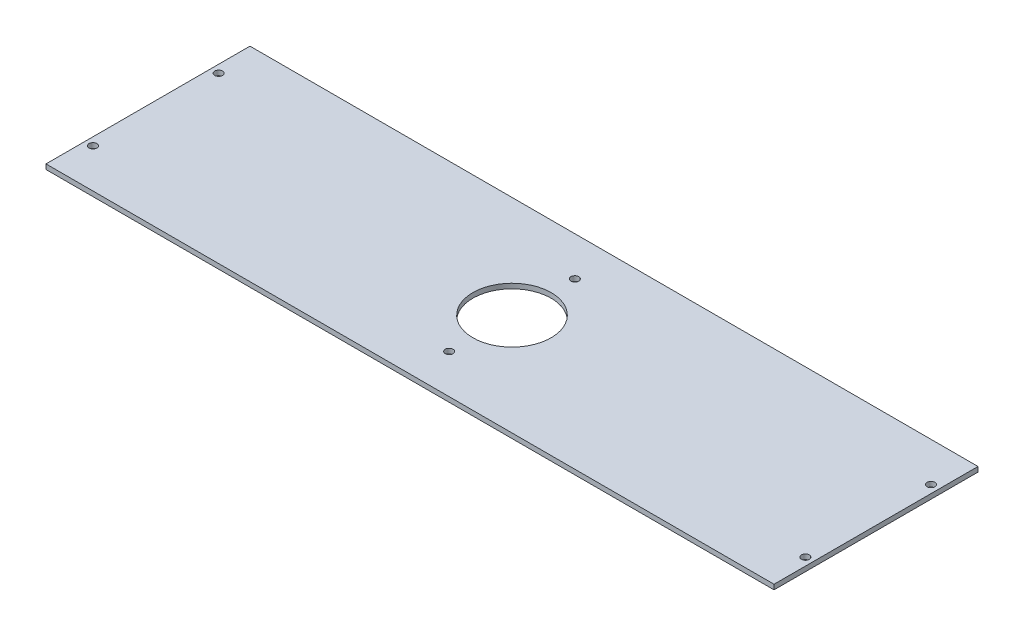
ISO-10303-21;
HEADER;
FILE_DESCRIPTION(('STEP AP214'),'2;1');
FILE_NAME('part.step','',(''),(''),'','','');
FILE_SCHEMA(('AUTOMOTIVE_DESIGN { 1 0 10303 214 1 1 1 1 }'));
ENDSEC;
DATA;
#1=APPLICATION_CONTEXT('core data for automotive mechanical design processes');
#2=APPLICATION_PROTOCOL_DEFINITION('international standard','automotive_design',2000,#1);
#3=PRODUCT_CONTEXT('',#1,'mechanical');
#4=PRODUCT('Part','Part','',(#3));
#5=PRODUCT_RELATED_PRODUCT_CATEGORY('part','',(#4));
#6=PRODUCT_DEFINITION_FORMATION('','',#4);
#7=PRODUCT_DEFINITION_CONTEXT('part definition',#1,'design');
#8=PRODUCT_DEFINITION('design','',#6,#7);
#9=PRODUCT_DEFINITION_SHAPE('','',#8);
#10=(LENGTH_UNIT() NAMED_UNIT(*) SI_UNIT(.MILLI.,.METRE.));
#11=(NAMED_UNIT(*) PLANE_ANGLE_UNIT() SI_UNIT($,.RADIAN.));
#12=(NAMED_UNIT(*) SI_UNIT($,.STERADIAN.) SOLID_ANGLE_UNIT());
#13=UNCERTAINTY_MEASURE_WITH_UNIT(LENGTH_MEASURE(1.E-05),#10,'distance_accuracy_value','');
#14=(GEOMETRIC_REPRESENTATION_CONTEXT(3) GLOBAL_UNCERTAINTY_ASSIGNED_CONTEXT((#13)) GLOBAL_UNIT_ASSIGNED_CONTEXT((#10,
#11,#12)) REPRESENTATION_CONTEXT('',''));
#15=CARTESIAN_POINT('',(0.,0.,0.));
#16=DIRECTION('',(0.,0.,1.));
#17=DIRECTION('',(1.,0.,0.));
#18=AXIS2_PLACEMENT_3D('',#15,#16,#17);
#19=CARTESIAN_POINT('',(-113.83018179896,2.5,-59.2961910720666));
#20=DIRECTION('',(1.,0.,0.));
#21=DIRECTION('',(0.,0.,-1.));
#22=AXIS2_PLACEMENT_3D('',#19,#20,#21);
#23=PLANE('',#22);
#24=DIRECTION('',(0.,0.,1.));
#25=VECTOR('',#24,1.);
#26=CARTESIAN_POINT('',(-113.83018179896,0.,-59.2961910720666));
#27=LINE('',#26,#25);
#28=CARTESIAN_POINT('',(-113.83018179896,0.,-59.2961910720666));
#29=VERTEX_POINT('',#28);
#30=CARTESIAN_POINT('',(-113.83018179896,0.,44.9238089279334));
#31=VERTEX_POINT('',#30);
#32=EDGE_CURVE('E109',#29,#31,#27,.T.);
#33=ORIENTED_EDGE('',*,*,#32,.T.);
#34=DIRECTION('',(0.,-1.,0.));
#35=VECTOR('',#34,1.);
#36=CARTESIAN_POINT('',(-113.83018179896,2.5,44.9238089279334));
#37=LINE('',#36,#35);
#38=CARTESIAN_POINT('',(-113.83018179896,2.5,44.9238089279334));
#39=VERTEX_POINT('',#38);
#40=EDGE_CURVE('E11',#39,#31,#37,.T.);
#41=ORIENTED_EDGE('',*,*,#40,.F.);
#42=DIRECTION('',(0.,0.,1.));
#43=VECTOR('',#42,1.);
#44=CARTESIAN_POINT('',(-113.83018179896,2.5,-59.2961910720666));
#45=LINE('',#44,#43);
#46=CARTESIAN_POINT('',(-113.83018179896,2.5,-59.2961910720666));
#47=VERTEX_POINT('',#46);
#48=EDGE_CURVE('E90',#47,#39,#45,.T.);
#49=ORIENTED_EDGE('',*,*,#48,.F.);
#50=DIRECTION('',(0.,-1.,0.));
#51=VECTOR('',#50,1.);
#52=CARTESIAN_POINT('',(-113.83018179896,2.5,-59.2961910720666));
#53=LINE('',#52,#51);
#54=EDGE_CURVE('E57',#47,#29,#53,.T.);
#55=ORIENTED_EDGE('',*,*,#54,.T.);
#56=EDGE_LOOP('',(#33,#41,#49,#55));
#57=FACE_BOUND('',#56,.T.);
#58=ADVANCED_FACE('F38',(#57),#23,.F.);
#59=CARTESIAN_POINT('',(-113.83018179896,2.5,44.9238089279334));
#60=DIRECTION('',(0.,0.,-1.));
#61=DIRECTION('',(-1.,0.,0.));
#62=AXIS2_PLACEMENT_3D('',#59,#60,#61);
#63=PLANE('',#62);
#64=DIRECTION('',(1.,0.,0.));
#65=VECTOR('',#64,1.);
#66=CARTESIAN_POINT('',(-113.83018179896,0.,44.9238089279334));
#67=LINE('',#66,#65);
#68=CARTESIAN_POINT('',(258.16981820104,0.,44.9238089279334));
#69=VERTEX_POINT('',#68);
#70=EDGE_CURVE('E96',#31,#69,#67,.T.);
#71=ORIENTED_EDGE('',*,*,#70,.T.);
#72=DIRECTION('',(0.,-1.,0.));
#73=VECTOR('',#72,1.);
#74=CARTESIAN_POINT('',(258.16981820104,2.5,44.9238089279334));
#75=LINE('',#74,#73);
#76=CARTESIAN_POINT('',(258.16981820104,2.5,44.9238089279334));
#77=VERTEX_POINT('',#76);
#78=EDGE_CURVE('E48',#77,#69,#75,.T.);
#79=ORIENTED_EDGE('',*,*,#78,.F.);
#80=DIRECTION('',(1.,0.,0.));
#81=VECTOR('',#80,1.);
#82=CARTESIAN_POINT('',(-113.83018179896,2.5,44.9238089279334));
#83=LINE('',#82,#81);
#84=EDGE_CURVE('E82',#39,#77,#83,.T.);
#85=ORIENTED_EDGE('',*,*,#84,.F.);
#86=ORIENTED_EDGE('',*,*,#40,.T.);
#87=EDGE_LOOP('',(#71,#79,#85,#86));
#88=FACE_BOUND('',#87,.T.);
#89=ADVANCED_FACE('F95',(#88),#63,.F.);
#90=CARTESIAN_POINT('',(258.16981820104,2.5,-59.2961910720666));
#91=DIRECTION('',(1.,0.,0.));
#92=DIRECTION('',(0.,0.,-1.));
#93=AXIS2_PLACEMENT_3D('',#90,#91,#92);
#94=PLANE('',#93);
#95=DIRECTION('',(0.,0.,1.));
#96=VECTOR('',#95,1.);
#97=CARTESIAN_POINT('',(258.16981820104,0.,-59.2961910720666));
#98=LINE('',#97,#96);
#99=CARTESIAN_POINT('',(258.16981820104,0.,-59.2961910720666));
#100=VERTEX_POINT('',#99);
#101=EDGE_CURVE('E115',#100,#69,#98,.T.);
#102=ORIENTED_EDGE('',*,*,#101,.F.);
#103=DIRECTION('',(0.,-1.,0.));
#104=VECTOR('',#103,1.);
#105=CARTESIAN_POINT('',(258.16981820104,2.5,-59.2961910720666));
#106=LINE('',#105,#104);
#107=CARTESIAN_POINT('',(258.16981820104,2.5,-59.2961910720666));
#108=VERTEX_POINT('',#107);
#109=EDGE_CURVE('E71',#108,#100,#106,.T.);
#110=ORIENTED_EDGE('',*,*,#109,.F.);
#111=DIRECTION('',(0.,0.,1.));
#112=VECTOR('',#111,1.);
#113=CARTESIAN_POINT('',(258.16981820104,2.5,-59.2961910720666));
#114=LINE('',#113,#112);
#115=EDGE_CURVE('E89',#108,#77,#114,.T.);
#116=ORIENTED_EDGE('',*,*,#115,.T.);
#117=ORIENTED_EDGE('',*,*,#78,.T.);
#118=EDGE_LOOP('',(#102,#110,#116,#117));
#119=FACE_BOUND('',#118,.T.);
#120=ADVANCED_FACE('F101',(#119),#94,.T.);
#121=CARTESIAN_POINT('',(-113.83018179896,2.5,-59.2961910720666));
#122=DIRECTION('',(0.,0.,-1.));
#123=DIRECTION('',(-1.,0.,0.));
#124=AXIS2_PLACEMENT_3D('',#121,#122,#123);
#125=PLANE('',#124);
#126=DIRECTION('',(1.,0.,0.));
#127=VECTOR('',#126,1.);
#128=CARTESIAN_POINT('',(-113.83018179896,0.,-59.2961910720666));
#129=LINE('',#128,#127);
#130=EDGE_CURVE('E118',#29,#100,#129,.T.);
#131=ORIENTED_EDGE('',*,*,#130,.F.);
#132=ORIENTED_EDGE('',*,*,#54,.F.);
#133=DIRECTION('',(1.,0.,0.));
#134=VECTOR('',#133,1.);
#135=CARTESIAN_POINT('',(-113.83018179896,2.5,-59.2961910720666));
#136=LINE('',#135,#134);
#137=EDGE_CURVE('E103',#47,#108,#136,.T.);
#138=ORIENTED_EDGE('',*,*,#137,.T.);
#139=ORIENTED_EDGE('',*,*,#109,.T.);
#140=EDGE_LOOP('',(#131,#132,#138,#139));
#141=FACE_BOUND('',#140,.T.);
#142=ADVANCED_FACE('F179',(#141),#125,.T.);
#143=CARTESIAN_POINT('',(0.,2.5,0.));
#144=DIRECTION('',(0.,1.,0.));
#145=DIRECTION('',(0.,0.,1.));
#146=AXIS2_PLACEMENT_3D('',#143,#144,#145);
#147=PLANE('',#146);
#148=CARTESIAN_POINT('',(72.16981820104,2.5,-7.18619107206665));
#149=DIRECTION('',(0.,1.,0.));
#150=DIRECTION('',(0.,0.,1.));
#151=AXIS2_PLACEMENT_3D('',#148,#149,#150);
#152=CIRCLE('',#151,20.);
#153=CARTESIAN_POINT('',(72.16981820104,2.5,12.8138089279334));
#154=VERTEX_POINT('',#153);
#155=EDGE_CURVE('E287',#154,#154,#152,.T.);
#156=ORIENTED_EDGE('',*,*,#155,.F.);
#157=EDGE_LOOP('',(#156));
#158=FACE_BOUND('',#157,.T.);
#159=CARTESIAN_POINT('',(72.16981820104,2.5,24.9238089279334));
#160=DIRECTION('',(0.,1.,0.));
#161=DIRECTION('',(0.,0.,1.));
#162=AXIS2_PLACEMENT_3D('',#159,#160,#161);
#163=CIRCLE('',#162,2.);
#164=CARTESIAN_POINT('',(72.16981820104,2.5,26.9238089279333));
#165=VERTEX_POINT('',#164);
#166=EDGE_CURVE('E146',#165,#165,#163,.T.);
#167=ORIENTED_EDGE('',*,*,#166,.F.);
#168=EDGE_LOOP('',(#167));
#169=FACE_BOUND('',#168,.T.);
#170=CARTESIAN_POINT('',(72.16981820104,2.5,-39.2961910720666));
#171=DIRECTION('',(0.,1.,0.));
#172=DIRECTION('',(0.,0.,1.));
#173=AXIS2_PLACEMENT_3D('',#170,#171,#172);
#174=CIRCLE('',#173,2.);
#175=CARTESIAN_POINT('',(72.16981820104,2.5,-37.2961910720666));
#176=VERTEX_POINT('',#175);
#177=EDGE_CURVE('E164',#176,#176,#174,.T.);
#178=ORIENTED_EDGE('',*,*,#177,.F.);
#179=EDGE_LOOP('',(#178));
#180=FACE_BOUND('',#179,.T.);
#181=CARTESIAN_POINT('',(254.16981820104,2.5,-39.2961910720666));
#182=DIRECTION('',(0.,1.,0.));
#183=DIRECTION('',(0.,0.,1.));
#184=AXIS2_PLACEMENT_3D('',#181,#182,#183);
#185=CIRCLE('',#184,2.);
#186=CARTESIAN_POINT('',(254.16981820104,2.5,-37.2961910720666));
#187=VERTEX_POINT('',#186);
#188=EDGE_CURVE('E160',#187,#187,#185,.T.);
#189=ORIENTED_EDGE('',*,*,#188,.F.);
#190=EDGE_LOOP('',(#189));
#191=FACE_BOUND('',#190,.T.);
#192=CARTESIAN_POINT('',(-109.83018179896,2.5,24.9238089279334));
#193=DIRECTION('',(0.,1.,0.));
#194=DIRECTION('',(0.,0.,1.));
#195=AXIS2_PLACEMENT_3D('',#192,#193,#194);
#196=CIRCLE('',#195,2.);
#197=CARTESIAN_POINT('',(-109.83018179896,2.5,26.9238089279333));
#198=VERTEX_POINT('',#197);
#199=EDGE_CURVE('E154',#198,#198,#196,.T.);
#200=ORIENTED_EDGE('',*,*,#199,.F.);
#201=EDGE_LOOP('',(#200));
#202=FACE_BOUND('',#201,.T.);
#203=CARTESIAN_POINT('',(254.16981820104,2.5,24.9238089279334));
#204=DIRECTION('',(0.,1.,0.));
#205=DIRECTION('',(0.,0.,1.));
#206=AXIS2_PLACEMENT_3D('',#203,#204,#205);
#207=CIRCLE('',#206,2.);
#208=CARTESIAN_POINT('',(254.16981820104,2.5,26.9238089279333));
#209=VERTEX_POINT('',#208);
#210=EDGE_CURVE('E149',#209,#209,#207,.T.);
#211=ORIENTED_EDGE('',*,*,#210,.F.);
#212=EDGE_LOOP('',(#211));
#213=FACE_BOUND('',#212,.T.);
#214=CARTESIAN_POINT('',(-109.83018179896,2.5,-39.2961910720666));
#215=DIRECTION('',(0.,1.,0.));
#216=DIRECTION('',(0.,0.,1.));
#217=AXIS2_PLACEMENT_3D('',#214,#215,#216);
#218=CIRCLE('',#217,2.);
#219=CARTESIAN_POINT('',(-109.83018179896,2.5,-37.2961910720666));
#220=VERTEX_POINT('',#219);
#221=EDGE_CURVE('E131',#220,#220,#218,.T.);
#222=ORIENTED_EDGE('',*,*,#221,.F.);
#223=EDGE_LOOP('',(#222));
#224=FACE_BOUND('',#223,.T.);
#225=ORIENTED_EDGE('',*,*,#48,.T.);
#226=ORIENTED_EDGE('',*,*,#84,.T.);
#227=ORIENTED_EDGE('',*,*,#115,.F.);
#228=ORIENTED_EDGE('',*,*,#137,.F.);
#229=EDGE_LOOP('',(#225,#226,#227,#228));
#230=FACE_BOUND('',#229,.T.);
#231=ADVANCED_FACE('F86',(#158,#169,#180,#191,#202,#213,#224,#230),#147,.T.);
#232=CARTESIAN_POINT('',(0.,0.,0.));
#233=DIRECTION('',(0.,1.,0.));
#234=DIRECTION('',(0.,0.,1.));
#235=AXIS2_PLACEMENT_3D('',#232,#233,#234);
#236=PLANE('',#235);
#237=CARTESIAN_POINT('',(72.16981820104,0.,-7.18619107206665));
#238=DIRECTION('',(0.,1.,0.));
#239=DIRECTION('',(0.,0.,1.));
#240=AXIS2_PLACEMENT_3D('',#237,#238,#239);
#241=CIRCLE('',#240,20.);
#242=CARTESIAN_POINT('',(72.16981820104,0.,12.8138089279334));
#243=VERTEX_POINT('',#242);
#244=EDGE_CURVE('E41',#243,#243,#241,.T.);
#245=ORIENTED_EDGE('',*,*,#244,.T.);
#246=EDGE_LOOP('',(#245));
#247=FACE_BOUND('',#246,.T.);
#248=CARTESIAN_POINT('',(72.16981820104,0.,24.9238089279334));
#249=DIRECTION('',(0.,1.,0.));
#250=DIRECTION('',(0.,0.,1.));
#251=AXIS2_PLACEMENT_3D('',#248,#249,#250);
#252=CIRCLE('',#251,2.);
#253=CARTESIAN_POINT('',(72.16981820104,0.,26.9238089279333));
#254=VERTEX_POINT('',#253);
#255=EDGE_CURVE('E145',#254,#254,#252,.T.);
#256=ORIENTED_EDGE('',*,*,#255,.T.);
#257=EDGE_LOOP('',(#256));
#258=FACE_BOUND('',#257,.T.);
#259=CARTESIAN_POINT('',(72.16981820104,0.,-39.2961910720666));
#260=DIRECTION('',(0.,1.,0.));
#261=DIRECTION('',(0.,0.,1.));
#262=AXIS2_PLACEMENT_3D('',#259,#260,#261);
#263=CIRCLE('',#262,2.);
#264=CARTESIAN_POINT('',(72.16981820104,0.,-37.2961910720666));
#265=VERTEX_POINT('',#264);
#266=EDGE_CURVE('E142',#265,#265,#263,.T.);
#267=ORIENTED_EDGE('',*,*,#266,.T.);
#268=EDGE_LOOP('',(#267));
#269=FACE_BOUND('',#268,.T.);
#270=CARTESIAN_POINT('',(254.16981820104,0.,-39.2961910720666));
#271=DIRECTION('',(0.,1.,0.));
#272=DIRECTION('',(0.,0.,1.));
#273=AXIS2_PLACEMENT_3D('',#270,#271,#272);
#274=CIRCLE('',#273,2.);
#275=CARTESIAN_POINT('',(254.16981820104,0.,-37.2961910720666));
#276=VERTEX_POINT('',#275);
#277=EDGE_CURVE('E112',#276,#276,#274,.T.);
#278=ORIENTED_EDGE('',*,*,#277,.T.);
#279=EDGE_LOOP('',(#278));
#280=FACE_BOUND('',#279,.T.);
#281=CARTESIAN_POINT('',(-109.83018179896,0.,24.9238089279334));
#282=DIRECTION('',(0.,1.,0.));
#283=DIRECTION('',(0.,0.,1.));
#284=AXIS2_PLACEMENT_3D('',#281,#282,#283);
#285=CIRCLE('',#284,2.);
#286=CARTESIAN_POINT('',(-109.83018179896,0.,26.9238089279333));
#287=VERTEX_POINT('',#286);
#288=EDGE_CURVE('E135',#287,#287,#285,.T.);
#289=ORIENTED_EDGE('',*,*,#288,.T.);
#290=EDGE_LOOP('',(#289));
#291=FACE_BOUND('',#290,.T.);
#292=CARTESIAN_POINT('',(254.16981820104,0.,24.9238089279334));
#293=DIRECTION('',(0.,1.,0.));
#294=DIRECTION('',(0.,0.,1.));
#295=AXIS2_PLACEMENT_3D('',#292,#293,#294);
#296=CIRCLE('',#295,2.);
#297=CARTESIAN_POINT('',(254.16981820104,0.,26.9238089279333));
#298=VERTEX_POINT('',#297);
#299=EDGE_CURVE('E130',#298,#298,#296,.T.);
#300=ORIENTED_EDGE('',*,*,#299,.T.);
#301=EDGE_LOOP('',(#300));
#302=FACE_BOUND('',#301,.T.);
#303=CARTESIAN_POINT('',(-109.83018179896,0.,-39.2961910720666));
#304=DIRECTION('',(0.,1.,0.));
#305=DIRECTION('',(0.,0.,1.));
#306=AXIS2_PLACEMENT_3D('',#303,#304,#305);
#307=CIRCLE('',#306,2.);
#308=CARTESIAN_POINT('',(-109.83018179896,0.,-37.2961910720666));
#309=VERTEX_POINT('',#308);
#310=EDGE_CURVE('E126',#309,#309,#307,.T.);
#311=ORIENTED_EDGE('',*,*,#310,.T.);
#312=EDGE_LOOP('',(#311));
#313=FACE_BOUND('',#312,.T.);
#314=ORIENTED_EDGE('',*,*,#32,.F.);
#315=ORIENTED_EDGE('',*,*,#130,.T.);
#316=ORIENTED_EDGE('',*,*,#101,.T.);
#317=ORIENTED_EDGE('',*,*,#70,.F.);
#318=EDGE_LOOP('',(#314,#315,#316,#317));
#319=FACE_BOUND('',#318,.T.);
#320=ADVANCED_FACE('F178',(#247,#258,#269,#280,#291,#302,#313,#319),#236,.F.);
#321=CARTESIAN_POINT('',(-109.83018179896,-7.5,-39.2961910720666));
#322=DIRECTION('',(0.,1.,0.));
#323=DIRECTION('',(0.,0.,1.));
#324=AXIS2_PLACEMENT_3D('',#321,#322,#323);
#325=CYLINDRICAL_SURFACE('',#324,2.);
#326=ORIENTED_EDGE('',*,*,#221,.T.);
#327=EDGE_LOOP('',(#326));
#328=FACE_BOUND('',#327,.T.);
#329=ORIENTED_EDGE('',*,*,#310,.F.);
#330=EDGE_LOOP('',(#329));
#331=FACE_BOUND('',#330,.T.);
#332=ADVANCED_FACE('F174',(#328,#331),#325,.F.);
#333=CARTESIAN_POINT('',(254.16981820104,-7.5,24.9238089279334));
#334=DIRECTION('',(0.,1.,0.));
#335=DIRECTION('',(0.,0.,1.));
#336=AXIS2_PLACEMENT_3D('',#333,#334,#335);
#337=CYLINDRICAL_SURFACE('',#336,2.);
#338=ORIENTED_EDGE('',*,*,#210,.T.);
#339=EDGE_LOOP('',(#338));
#340=FACE_BOUND('',#339,.T.);
#341=ORIENTED_EDGE('',*,*,#299,.F.);
#342=EDGE_LOOP('',(#341));
#343=FACE_BOUND('',#342,.T.);
#344=ADVANCED_FACE('F226',(#340,#343),#337,.F.);
#345=CARTESIAN_POINT('',(-109.83018179896,-7.5,24.9238089279334));
#346=DIRECTION('',(0.,1.,0.));
#347=DIRECTION('',(0.,0.,1.));
#348=AXIS2_PLACEMENT_3D('',#345,#346,#347);
#349=CYLINDRICAL_SURFACE('',#348,2.);
#350=ORIENTED_EDGE('',*,*,#199,.T.);
#351=EDGE_LOOP('',(#350));
#352=FACE_BOUND('',#351,.T.);
#353=ORIENTED_EDGE('',*,*,#288,.F.);
#354=EDGE_LOOP('',(#353));
#355=FACE_BOUND('',#354,.T.);
#356=ADVANCED_FACE('F231',(#352,#355),#349,.F.);
#357=CARTESIAN_POINT('',(254.16981820104,-7.5,-39.2961910720666));
#358=DIRECTION('',(0.,1.,0.));
#359=DIRECTION('',(0.,0.,1.));
#360=AXIS2_PLACEMENT_3D('',#357,#358,#359);
#361=CYLINDRICAL_SURFACE('',#360,2.);
#362=ORIENTED_EDGE('',*,*,#188,.T.);
#363=EDGE_LOOP('',(#362));
#364=FACE_BOUND('',#363,.T.);
#365=ORIENTED_EDGE('',*,*,#277,.F.);
#366=EDGE_LOOP('',(#365));
#367=FACE_BOUND('',#366,.T.);
#368=ADVANCED_FACE('F238',(#364,#367),#361,.F.);
#369=CARTESIAN_POINT('',(72.16981820104,-7.5,-39.2961910720666));
#370=DIRECTION('',(0.,1.,0.));
#371=DIRECTION('',(0.,0.,1.));
#372=AXIS2_PLACEMENT_3D('',#369,#370,#371);
#373=CYLINDRICAL_SURFACE('',#372,2.);
#374=ORIENTED_EDGE('',*,*,#177,.T.);
#375=EDGE_LOOP('',(#374));
#376=FACE_BOUND('',#375,.T.);
#377=ORIENTED_EDGE('',*,*,#266,.F.);
#378=EDGE_LOOP('',(#377));
#379=FACE_BOUND('',#378,.T.);
#380=ADVANCED_FACE('F246',(#376,#379),#373,.F.);
#381=CARTESIAN_POINT('',(72.16981820104,-7.5,24.9238089279334));
#382=DIRECTION('',(0.,1.,0.));
#383=DIRECTION('',(0.,0.,1.));
#384=AXIS2_PLACEMENT_3D('',#381,#382,#383);
#385=CYLINDRICAL_SURFACE('',#384,2.);
#386=ORIENTED_EDGE('',*,*,#166,.T.);
#387=EDGE_LOOP('',(#386));
#388=FACE_BOUND('',#387,.T.);
#389=ORIENTED_EDGE('',*,*,#255,.F.);
#390=EDGE_LOOP('',(#389));
#391=FACE_BOUND('',#390,.T.);
#392=ADVANCED_FACE('F254',(#388,#391),#385,.F.);
#393=CARTESIAN_POINT('',(72.16981820104,-23.5,-7.18619107206665));
#394=DIRECTION('',(0.,1.,0.));
#395=DIRECTION('',(0.,0.,1.));
#396=AXIS2_PLACEMENT_3D('',#393,#394,#395);
#397=CYLINDRICAL_SURFACE('',#396,20.);
#398=CARTESIAN_POINT('',(72.16981820104,2.5,12.8138089279334));
#399=CARTESIAN_POINT('',(72.16981820104,2.47395833333334,12.8138089279334));
#400=CARTESIAN_POINT('',(72.16981820104,2.44791666666667,12.8138089279334));
#401=CARTESIAN_POINT('',(72.16981820104,2.39583333333334,12.8138089279334));
#402=CARTESIAN_POINT('',(72.16981820104,2.36979166666667,12.8138089279334));
#403=CARTESIAN_POINT('',(72.16981820104,2.31770833333333,12.8138089279334));
#404=CARTESIAN_POINT('',(72.16981820104,2.29166666666667,12.8138089279334));
#405=CARTESIAN_POINT('',(72.16981820104,2.23958333333333,12.8138089279334));
#406=CARTESIAN_POINT('',(72.16981820104,2.21354166666667,12.8138089279334));
#407=CARTESIAN_POINT('',(72.16981820104,2.16145833333334,12.8138089279334));
#408=CARTESIAN_POINT('',(72.16981820104,2.13541666666667,12.8138089279334));
#409=CARTESIAN_POINT('',(72.16981820104,2.08333333333334,12.8138089279334));
#410=CARTESIAN_POINT('',(72.16981820104,2.05729166666667,12.8138089279334));
#411=CARTESIAN_POINT('',(72.16981820104,2.00520833333333,12.8138089279334));
#412=CARTESIAN_POINT('',(72.16981820104,1.97916666666667,12.8138089279334));
#413=CARTESIAN_POINT('',(72.16981820104,1.92708333333333,12.8138089279334));
#414=CARTESIAN_POINT('',(72.16981820104,1.90104166666667,12.8138089279334));
#415=CARTESIAN_POINT('',(72.16981820104,1.84895833333334,12.8138089279334));
#416=CARTESIAN_POINT('',(72.16981820104,1.82291666666667,12.8138089279334));
#417=CARTESIAN_POINT('',(72.16981820104,1.77083333333334,12.8138089279334));
#418=CARTESIAN_POINT('',(72.16981820104,1.74479166666667,12.8138089279334));
#419=CARTESIAN_POINT('',(72.16981820104,1.69270833333333,12.8138089279334));
#420=CARTESIAN_POINT('',(72.16981820104,1.66666666666667,12.8138089279334));
#421=CARTESIAN_POINT('',(72.16981820104,1.61458333333333,12.8138089279334));
#422=CARTESIAN_POINT('',(72.16981820104,1.58854166666667,12.8138089279334));
#423=CARTESIAN_POINT('',(72.16981820104,1.53645833333334,12.8138089279334));
#424=CARTESIAN_POINT('',(72.16981820104,1.51041666666667,12.8138089279334));
#425=CARTESIAN_POINT('',(72.16981820104,1.45833333333334,12.8138089279334));
#426=CARTESIAN_POINT('',(72.16981820104,1.43229166666667,12.8138089279334));
#427=CARTESIAN_POINT('',(72.16981820104,1.38020833333333,12.8138089279334));
#428=CARTESIAN_POINT('',(72.16981820104,1.35416666666667,12.8138089279334));
#429=CARTESIAN_POINT('',(72.16981820104,1.30208333333333,12.8138089279334));
#430=CARTESIAN_POINT('',(72.16981820104,1.27604166666667,12.8138089279334));
#431=CARTESIAN_POINT('',(72.16981820104,1.22395833333334,12.8138089279334));
#432=CARTESIAN_POINT('',(72.16981820104,1.19791666666667,12.8138089279334));
#433=CARTESIAN_POINT('',(72.16981820104,1.14583333333334,12.8138089279334));
#434=CARTESIAN_POINT('',(72.16981820104,1.11979166666667,12.8138089279334));
#435=CARTESIAN_POINT('',(72.16981820104,1.06770833333333,12.8138089279334));
#436=CARTESIAN_POINT('',(72.16981820104,1.04166666666667,12.8138089279334));
#437=CARTESIAN_POINT('',(72.16981820104,0.989583333333333,12.8138089279334));
#438=CARTESIAN_POINT('',(72.16981820104,0.963541666666667,12.8138089279334));
#439=CARTESIAN_POINT('',(72.16981820104,0.911458333333335,12.8138089279334));
#440=CARTESIAN_POINT('',(72.16981820104,0.885416666666669,12.8138089279334));
#441=CARTESIAN_POINT('',(72.16981820104,0.833333333333335,12.8138089279334));
#442=CARTESIAN_POINT('',(72.16981820104,0.807291666666668,12.8138089279334));
#443=CARTESIAN_POINT('',(72.16981820104,0.755208333333333,12.8138089279334));
#444=CARTESIAN_POINT('',(72.16981820104,0.729166666666666,12.8138089279334));
#445=CARTESIAN_POINT('',(72.16981820104,0.677083333333333,12.8138089279334));
#446=CARTESIAN_POINT('',(72.16981820104,0.651041666666667,12.8138089279334));
#447=CARTESIAN_POINT('',(72.16981820104,0.598958333333334,12.8138089279334));
#448=CARTESIAN_POINT('',(72.16981820104,0.572916666666668,12.8138089279334));
#449=CARTESIAN_POINT('',(72.16981820104,0.520833333333335,12.8138089279334));
#450=CARTESIAN_POINT('',(72.16981820104,0.494791666666668,12.8138089279334));
#451=CARTESIAN_POINT('',(72.16981820104,0.442708333333333,12.8138089279334));
#452=CARTESIAN_POINT('',(72.16981820104,0.416666666666666,12.8138089279334));
#453=CARTESIAN_POINT('',(72.16981820104,0.364583333333332,12.8138089279334));
#454=CARTESIAN_POINT('',(72.16981820104,0.338541666666666,12.8138089279334));
#455=CARTESIAN_POINT('',(72.16981820104,0.286458333333334,12.8138089279334));
#456=CARTESIAN_POINT('',(72.16981820104,0.260416666666668,12.8138089279334));
#457=CARTESIAN_POINT('',(72.16981820104,0.208333333333335,12.8138089279334));
#458=CARTESIAN_POINT('',(72.16981820104,0.182291666666667,12.8138089279334));
#459=CARTESIAN_POINT('',(72.16981820104,0.130208333333333,12.8138089279334));
#460=CARTESIAN_POINT('',(72.16981820104,0.104166666666666,12.8138089279334));
#461=CARTESIAN_POINT('',(72.16981820104,0.0520833333333322,12.8138089279334));
#462=CARTESIAN_POINT('',(72.16981820104,0.0260416666666661,12.8138089279334));
#463=CARTESIAN_POINT('',(72.16981820104,0.,12.8138089279334));
#464=B_SPLINE_CURVE_WITH_KNOTS('',3,(#398,#399,#400,#401,#402,#403,#404,#405,#406,#407,#408,
#409,#410,#411,#412,#413,#414,#415,#416,#417,#418,#419,#420,#421,#422,#423,#424,#425,#426,#427,
#428,#429,#430,#431,#432,#433,#434,#435,#436,#437,#438,#439,#440,#441,#442,#443,#444,#445,#446,
#447,#448,#449,#450,#451,#452,#453,#454,#455,#456,#457,#458,#459,#460,#461,#462,#463),
.UNSPECIFIED.,.F.,.F.,(4,2,2,2,2,2,2,2,2,2,2,2,2,2,2,2,2,2,2,2,2,2,2,2,2,2,2,2,2,2,2,2,4),(0.,
0.0781249999999983,0.15625,0.234375000000002,0.3125,0.390624999999999,0.46875,0.546875000000002,
0.625000000000001,0.703124999999999,0.781250000000001,0.859375000000002,0.937500000000001,
1.015625,1.09375,1.171875,1.25,1.328125,1.40625,1.484375,1.5625,1.640625,1.71875,1.796875,1.875,
1.953125,2.03125,2.109375,2.1875,2.265625,2.34375,2.421875,2.5),.UNSPECIFIED.);
#465=EDGE_CURVE('BSEAM261',#154,#243,#464,.T.);
#466=ORIENTED_EDGE('',*,*,#155,.T.);
#467=ORIENTED_EDGE('',*,*,#244,.F.);
#468=ORIENTED_EDGE('',*,*,#465,.T.);
#469=ORIENTED_EDGE('',*,*,#465,.F.);
#470=EDGE_LOOP('',(#466,#468,#467,#469));
#471=FACE_BOUND('',#470,.T.);
#472=ADVANCED_FACE('F261',(#471),#397,.F.);
#473=CLOSED_SHELL('',(#58,#89,#120,#142,#231,#320,#332,#344,#356,#368,#380,#392,#472));
#474=MANIFOLD_SOLID_BREP('B2',#473);
#475=ADVANCED_BREP_SHAPE_REPRESENTATION('',(#18,#474),#14);
#476=SHAPE_DEFINITION_REPRESENTATION(#9,#475);
ENDSEC;
END-ISO-10303-21;
